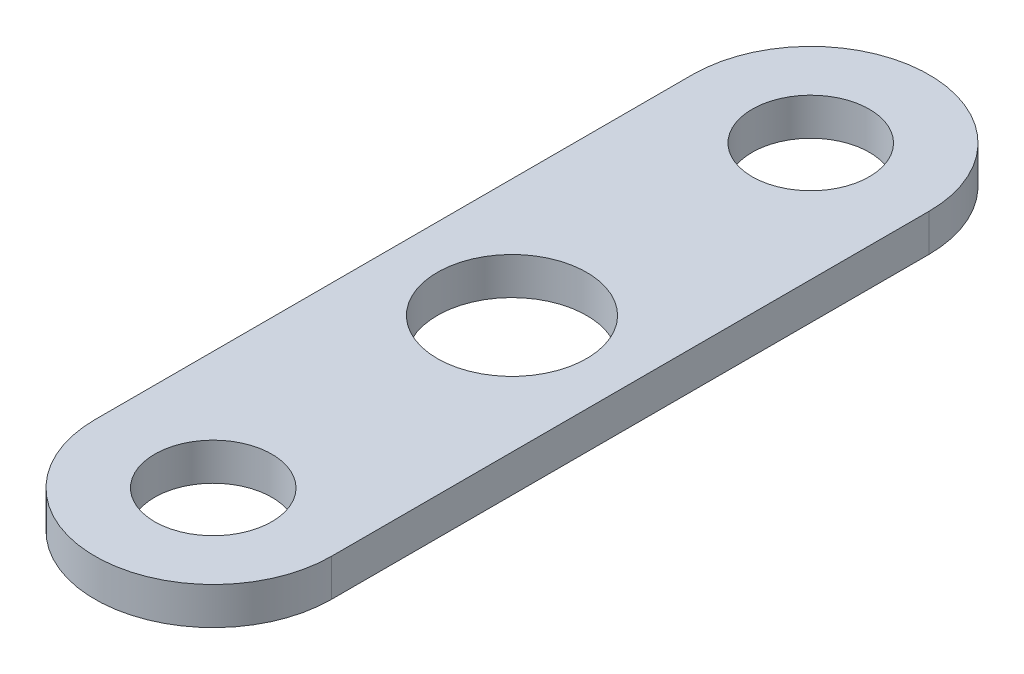
ISO-10303-21;
HEADER;
FILE_DESCRIPTION(('STEP AP214'),'2;1');
FILE_NAME('part.step','',(''),(''),'','','');
FILE_SCHEMA(('AUTOMOTIVE_DESIGN { 1 0 10303 214 1 1 1 1 }'));
ENDSEC;
DATA;
#1=APPLICATION_CONTEXT('core data for automotive mechanical design processes');
#2=APPLICATION_PROTOCOL_DEFINITION('international standard','automotive_design',2000,#1);
#3=PRODUCT_CONTEXT('',#1,'mechanical');
#4=PRODUCT('Part','Part','',(#3));
#5=PRODUCT_RELATED_PRODUCT_CATEGORY('part','',(#4));
#6=PRODUCT_DEFINITION_FORMATION('','',#4);
#7=PRODUCT_DEFINITION_CONTEXT('part definition',#1,'design');
#8=PRODUCT_DEFINITION('design','',#6,#7);
#9=PRODUCT_DEFINITION_SHAPE('','',#8);
#10=(LENGTH_UNIT() NAMED_UNIT(*) SI_UNIT(.MILLI.,.METRE.));
#11=(NAMED_UNIT(*) PLANE_ANGLE_UNIT() SI_UNIT($,.RADIAN.));
#12=(NAMED_UNIT(*) SI_UNIT($,.STERADIAN.) SOLID_ANGLE_UNIT());
#13=UNCERTAINTY_MEASURE_WITH_UNIT(LENGTH_MEASURE(1.E-05),#10,'distance_accuracy_value','');
#14=(GEOMETRIC_REPRESENTATION_CONTEXT(3) GLOBAL_UNCERTAINTY_ASSIGNED_CONTEXT((#13)) GLOBAL_UNIT_ASSIGNED_CONTEXT((#10,
#11,#12)) REPRESENTATION_CONTEXT('',''));
#15=CARTESIAN_POINT('',(0.,0.,0.));
#16=DIRECTION('',(0.,0.,1.));
#17=DIRECTION('',(1.,0.,0.));
#18=AXIS2_PLACEMENT_3D('',#15,#16,#17);
#19=CARTESIAN_POINT('',(0.,1.5875,12.7));
#20=DIRECTION('',(0.,1.,0.));
#21=DIRECTION('',(0.,0.,1.));
#22=AXIS2_PLACEMENT_3D('',#19,#20,#21);
#23=PLANE('',#22);
#24=CARTESIAN_POINT('',(0.,1.5875,-12.7));
#25=DIRECTION('',(0.,1.,0.));
#26=DIRECTION('',(0.,0.,1.));
#27=AXIS2_PLACEMENT_3D('',#24,#25,#26);
#28=CIRCLE('',#27,2.4892);
#29=CARTESIAN_POINT('',(0.,1.5875,-10.2108));
#30=VERTEX_POINT('',#29);
#31=EDGE_CURVE('E119',#30,#30,#28,.T.);
#32=ORIENTED_EDGE('',*,*,#31,.F.);
#33=EDGE_LOOP('',(#32));
#34=FACE_BOUND('',#33,.T.);
#35=CARTESIAN_POINT('',(0.,1.5875,12.7));
#36=DIRECTION('',(0.,1.,0.));
#37=DIRECTION('',(0.,0.,1.));
#38=AXIS2_PLACEMENT_3D('',#35,#36,#37);
#39=CIRCLE('',#38,5.0292);
#40=CARTESIAN_POINT('',(-5.0292,1.5875,12.7));
#41=VERTEX_POINT('',#40);
#42=CARTESIAN_POINT('',(5.0292,1.5875,12.7));
#43=VERTEX_POINT('',#42);
#44=EDGE_CURVE('E89',#41,#43,#39,.T.);
#45=ORIENTED_EDGE('',*,*,#44,.T.);
#46=DIRECTION('',(0.,0.,-1.));
#47=VECTOR('',#46,1.);
#48=CARTESIAN_POINT('',(5.0292,1.5875,12.7));
#49=LINE('',#48,#47);
#50=CARTESIAN_POINT('',(5.02919999999999,1.5875,-12.7));
#51=VERTEX_POINT('',#50);
#52=EDGE_CURVE('E84',#43,#51,#49,.T.);
#53=ORIENTED_EDGE('',*,*,#52,.T.);
#54=CARTESIAN_POINT('',(0.,1.5875,-12.7));
#55=DIRECTION('',(0.,1.,0.));
#56=DIRECTION('',(0.,0.,1.));
#57=AXIS2_PLACEMENT_3D('',#54,#55,#56);
#58=CIRCLE('',#57,5.0292);
#59=CARTESIAN_POINT('',(-5.0292,1.5875,-12.7));
#60=VERTEX_POINT('',#59);
#61=EDGE_CURVE('E87',#51,#60,#58,.T.);
#62=ORIENTED_EDGE('',*,*,#61,.T.);
#63=DIRECTION('',(0.,0.,1.));
#64=VECTOR('',#63,1.);
#65=CARTESIAN_POINT('',(-5.0292,1.5875,-12.7));
#66=LINE('',#65,#64);
#67=EDGE_CURVE('E54',#60,#41,#66,.T.);
#68=ORIENTED_EDGE('',*,*,#67,.T.);
#69=EDGE_LOOP('',(#45,#53,#62,#68));
#70=FACE_BOUND('',#69,.T.);
#71=CARTESIAN_POINT('',(0.,1.5875,0.));
#72=DIRECTION('',(0.,1.,0.));
#73=DIRECTION('',(0.,0.,1.));
#74=AXIS2_PLACEMENT_3D('',#71,#72,#73);
#75=CIRCLE('',#74,3.175);
#76=CARTESIAN_POINT('',(0.,1.5875,3.175));
#77=VERTEX_POINT('',#76);
#78=EDGE_CURVE('E104',#77,#77,#75,.T.);
#79=ORIENTED_EDGE('',*,*,#78,.F.);
#80=EDGE_LOOP('',(#79));
#81=FACE_BOUND('',#80,.T.);
#82=CARTESIAN_POINT('',(0.,1.5875,12.7));
#83=DIRECTION('',(0.,1.,0.));
#84=DIRECTION('',(0.,0.,1.));
#85=AXIS2_PLACEMENT_3D('',#82,#83,#84);
#86=CIRCLE('',#85,2.4892);
#87=CARTESIAN_POINT('',(0.,1.5875,15.1892));
#88=VERTEX_POINT('',#87);
#89=EDGE_CURVE('E125',#88,#88,#86,.T.);
#90=ORIENTED_EDGE('',*,*,#89,.F.);
#91=EDGE_LOOP('',(#90));
#92=FACE_BOUND('',#91,.T.);
#93=ADVANCED_FACE('F37',(#34,#70,#81,#92),#23,.T.);
#94=CARTESIAN_POINT('',(0.,0.,12.7));
#95=DIRECTION('',(0.,1.,0.));
#96=DIRECTION('',(0.,0.,1.));
#97=AXIS2_PLACEMENT_3D('',#94,#95,#96);
#98=PLANE('',#97);
#99=CARTESIAN_POINT('',(0.,0.,12.7));
#100=DIRECTION('',(0.,1.,0.));
#101=DIRECTION('',(0.,0.,1.));
#102=AXIS2_PLACEMENT_3D('',#99,#100,#101);
#103=CIRCLE('',#102,5.0292);
#104=CARTESIAN_POINT('',(-5.0292,0.,12.7));
#105=VERTEX_POINT('',#104);
#106=CARTESIAN_POINT('',(5.0292,0.,12.7));
#107=VERTEX_POINT('',#106);
#108=EDGE_CURVE('E101',#105,#107,#103,.T.);
#109=ORIENTED_EDGE('',*,*,#108,.F.);
#110=DIRECTION('',(0.,0.,1.));
#111=VECTOR('',#110,1.);
#112=CARTESIAN_POINT('',(-5.0292,0.,-12.7));
#113=LINE('',#112,#111);
#114=CARTESIAN_POINT('',(-5.0292,0.,-12.7));
#115=VERTEX_POINT('',#114);
#116=EDGE_CURVE('E77',#115,#105,#113,.T.);
#117=ORIENTED_EDGE('',*,*,#116,.F.);
#118=CARTESIAN_POINT('',(0.,0.,-12.7));
#119=DIRECTION('',(0.,1.,0.));
#120=DIRECTION('',(0.,0.,1.));
#121=AXIS2_PLACEMENT_3D('',#118,#119,#120);
#122=CIRCLE('',#121,5.0292);
#123=CARTESIAN_POINT('',(5.02919999999999,0.,-12.7));
#124=VERTEX_POINT('',#123);
#125=EDGE_CURVE('E71',#124,#115,#122,.T.);
#126=ORIENTED_EDGE('',*,*,#125,.F.);
#127=DIRECTION('',(0.,0.,-1.));
#128=VECTOR('',#127,1.);
#129=CARTESIAN_POINT('',(5.0292,0.,12.7));
#130=LINE('',#129,#128);
#131=EDGE_CURVE('E93',#107,#124,#130,.T.);
#132=ORIENTED_EDGE('',*,*,#131,.F.);
#133=EDGE_LOOP('',(#109,#117,#126,#132));
#134=FACE_BOUND('',#133,.T.);
#135=CARTESIAN_POINT('',(0.,0.,0.));
#136=DIRECTION('',(0.,1.,0.));
#137=DIRECTION('',(0.,0.,1.));
#138=AXIS2_PLACEMENT_3D('',#135,#136,#137);
#139=CIRCLE('',#138,3.175);
#140=CARTESIAN_POINT('',(0.,0.,3.175));
#141=VERTEX_POINT('',#140);
#142=EDGE_CURVE('E116',#141,#141,#139,.T.);
#143=ORIENTED_EDGE('',*,*,#142,.T.);
#144=EDGE_LOOP('',(#143));
#145=FACE_BOUND('',#144,.T.);
#146=CARTESIAN_POINT('',(0.,0.,-12.7));
#147=DIRECTION('',(0.,1.,0.));
#148=DIRECTION('',(0.,0.,1.));
#149=AXIS2_PLACEMENT_3D('',#146,#147,#148);
#150=CIRCLE('',#149,2.4892);
#151=CARTESIAN_POINT('',(0.,0.,-10.2108));
#152=VERTEX_POINT('',#151);
#153=EDGE_CURVE('E122',#152,#152,#150,.T.);
#154=ORIENTED_EDGE('',*,*,#153,.T.);
#155=EDGE_LOOP('',(#154));
#156=FACE_BOUND('',#155,.T.);
#157=CARTESIAN_POINT('',(0.,0.,12.7));
#158=DIRECTION('',(0.,1.,0.));
#159=DIRECTION('',(0.,0.,1.));
#160=AXIS2_PLACEMENT_3D('',#157,#158,#159);
#161=CIRCLE('',#160,2.4892);
#162=CARTESIAN_POINT('',(0.,0.,15.1892));
#163=VERTEX_POINT('',#162);
#164=EDGE_CURVE('E128',#163,#163,#161,.T.);
#165=ORIENTED_EDGE('',*,*,#164,.T.);
#166=EDGE_LOOP('',(#165));
#167=FACE_BOUND('',#166,.T.);
#168=ADVANCED_FACE('F112',(#134,#145,#156,#167),#98,.F.);
#169=CARTESIAN_POINT('',(0.,1.5875,12.7));
#170=DIRECTION('',(0.,-1.,0.));
#171=DIRECTION('',(0.,0.,-1.));
#172=AXIS2_PLACEMENT_3D('',#169,#170,#171);
#173=CYLINDRICAL_SURFACE('',#172,5.0292);
#174=ORIENTED_EDGE('',*,*,#108,.T.);
#175=DIRECTION('',(0.,-1.,0.));
#176=VECTOR('',#175,1.);
#177=CARTESIAN_POINT('',(5.0292,1.5875,12.7));
#178=LINE('',#177,#176);
#179=EDGE_CURVE('E11',#43,#107,#178,.T.);
#180=ORIENTED_EDGE('',*,*,#179,.F.);
#181=ORIENTED_EDGE('',*,*,#44,.F.);
#182=DIRECTION('',(0.,-1.,0.));
#183=VECTOR('',#182,1.);
#184=CARTESIAN_POINT('',(-5.0292,1.5875,12.7));
#185=LINE('',#184,#183);
#186=EDGE_CURVE('E97',#41,#105,#185,.T.);
#187=ORIENTED_EDGE('',*,*,#186,.T.);
#188=EDGE_LOOP('',(#174,#180,#181,#187));
#189=FACE_BOUND('',#188,.T.);
#190=ADVANCED_FACE('F39',(#189),#173,.T.);
#191=CARTESIAN_POINT('',(5.0292,1.5875,12.7));
#192=DIRECTION('',(-1.,0.,0.));
#193=DIRECTION('',(0.,0.,1.));
#194=AXIS2_PLACEMENT_3D('',#191,#192,#193);
#195=PLANE('',#194);
#196=ORIENTED_EDGE('',*,*,#131,.T.);
#197=DIRECTION('',(0.,-1.,0.));
#198=VECTOR('',#197,1.);
#199=CARTESIAN_POINT('',(5.02919999999999,1.5875,-12.7));
#200=LINE('',#199,#198);
#201=EDGE_CURVE('E46',#51,#124,#200,.T.);
#202=ORIENTED_EDGE('',*,*,#201,.F.);
#203=ORIENTED_EDGE('',*,*,#52,.F.);
#204=ORIENTED_EDGE('',*,*,#179,.T.);
#205=EDGE_LOOP('',(#196,#202,#203,#204));
#206=FACE_BOUND('',#205,.T.);
#207=ADVANCED_FACE('F92',(#206),#195,.F.);
#208=CARTESIAN_POINT('',(0.,1.5875,-12.7));
#209=DIRECTION('',(0.,-1.,0.));
#210=DIRECTION('',(0.,0.,-1.));
#211=AXIS2_PLACEMENT_3D('',#208,#209,#210);
#212=CYLINDRICAL_SURFACE('',#211,5.0292);
#213=ORIENTED_EDGE('',*,*,#125,.T.);
#214=DIRECTION('',(0.,-1.,0.));
#215=VECTOR('',#214,1.);
#216=CARTESIAN_POINT('',(-5.0292,1.5875,-12.7));
#217=LINE('',#216,#215);
#218=EDGE_CURVE('E94',#60,#115,#217,.T.);
#219=ORIENTED_EDGE('',*,*,#218,.F.);
#220=ORIENTED_EDGE('',*,*,#61,.F.);
#221=ORIENTED_EDGE('',*,*,#201,.T.);
#222=EDGE_LOOP('',(#213,#219,#220,#221));
#223=FACE_BOUND('',#222,.T.);
#224=ADVANCED_FACE('F95',(#223),#212,.T.);
#225=CARTESIAN_POINT('',(-5.0292,1.5875,-12.7));
#226=DIRECTION('',(1.,0.,0.));
#227=DIRECTION('',(0.,0.,-1.));
#228=AXIS2_PLACEMENT_3D('',#225,#226,#227);
#229=PLANE('',#228);
#230=ORIENTED_EDGE('',*,*,#116,.T.);
#231=ORIENTED_EDGE('',*,*,#186,.F.);
#232=ORIENTED_EDGE('',*,*,#67,.F.);
#233=ORIENTED_EDGE('',*,*,#218,.T.);
#234=EDGE_LOOP('',(#230,#231,#232,#233));
#235=FACE_BOUND('',#234,.T.);
#236=ADVANCED_FACE('F109',(#235),#229,.F.);
#237=CARTESIAN_POINT('',(0.,1.5875,0.));
#238=DIRECTION('',(0.,-1.,0.));
#239=DIRECTION('',(0.,0.,-1.));
#240=AXIS2_PLACEMENT_3D('',#237,#238,#239);
#241=CYLINDRICAL_SURFACE('',#240,3.175);
#242=ORIENTED_EDGE('',*,*,#78,.T.);
#243=EDGE_LOOP('',(#242));
#244=FACE_BOUND('',#243,.T.);
#245=ORIENTED_EDGE('',*,*,#142,.F.);
#246=EDGE_LOOP('',(#245));
#247=FACE_BOUND('',#246,.T.);
#248=ADVANCED_FACE('F146',(#244,#247),#241,.F.);
#249=CARTESIAN_POINT('',(0.,1.5875,-12.7));
#250=DIRECTION('',(0.,-1.,0.));
#251=DIRECTION('',(0.,0.,-1.));
#252=AXIS2_PLACEMENT_3D('',#249,#250,#251);
#253=CYLINDRICAL_SURFACE('',#252,2.4892);
#254=ORIENTED_EDGE('',*,*,#31,.T.);
#255=EDGE_LOOP('',(#254));
#256=FACE_BOUND('',#255,.T.);
#257=ORIENTED_EDGE('',*,*,#153,.F.);
#258=EDGE_LOOP('',(#257));
#259=FACE_BOUND('',#258,.T.);
#260=ADVANCED_FACE('F200',(#256,#259),#253,.F.);
#261=CARTESIAN_POINT('',(0.,1.5875,12.7));
#262=DIRECTION('',(0.,-1.,0.));
#263=DIRECTION('',(0.,0.,-1.));
#264=AXIS2_PLACEMENT_3D('',#261,#262,#263);
#265=CYLINDRICAL_SURFACE('',#264,2.4892);
#266=ORIENTED_EDGE('',*,*,#89,.T.);
#267=EDGE_LOOP('',(#266));
#268=FACE_BOUND('',#267,.T.);
#269=ORIENTED_EDGE('',*,*,#164,.F.);
#270=EDGE_LOOP('',(#269));
#271=FACE_BOUND('',#270,.T.);
#272=ADVANCED_FACE('F134',(#268,#271),#265,.F.);
#273=CLOSED_SHELL('',(#93,#168,#190,#207,#224,#236,#248,#260,#272));
#274=MANIFOLD_SOLID_BREP('B2',#273);
#275=ADVANCED_BREP_SHAPE_REPRESENTATION('',(#18,#274),#14);
#276=SHAPE_DEFINITION_REPRESENTATION(#9,#275);
ENDSEC;
END-ISO-10303-21;
